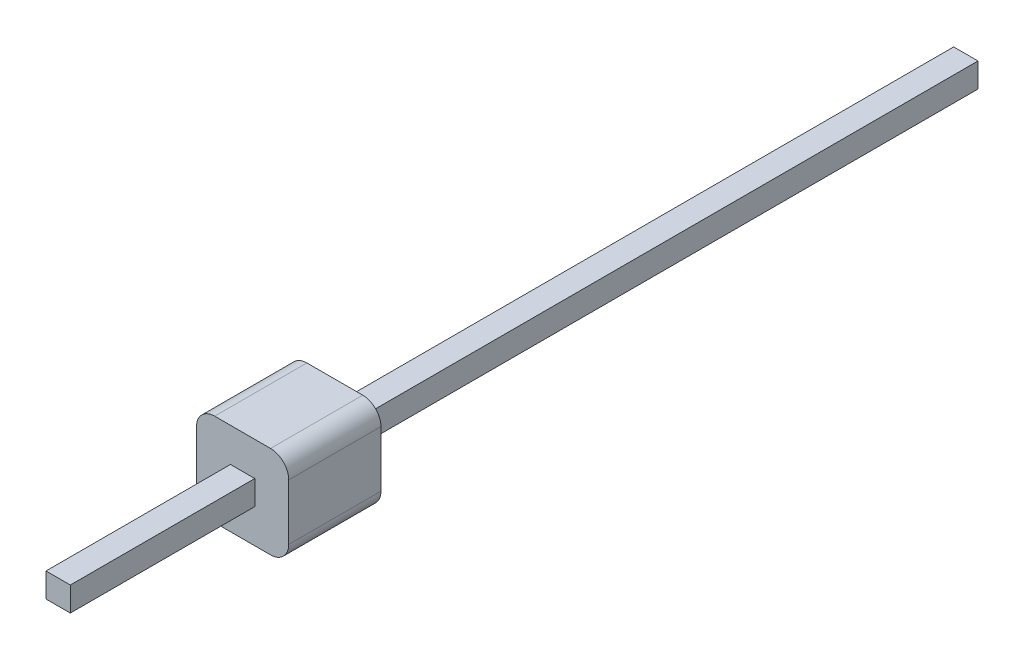
ISO-10303-21;
HEADER;
FILE_DESCRIPTION(('STEP AP214'),'2;1');
FILE_NAME('part.step','',(''),(''),'','','');
FILE_SCHEMA(('AUTOMOTIVE_DESIGN { 1 0 10303 214 1 1 1 1 }'));
ENDSEC;
DATA;
#1=APPLICATION_CONTEXT('core data for automotive mechanical design processes');
#2=APPLICATION_PROTOCOL_DEFINITION('international standard','automotive_design',2000,#1);
#3=PRODUCT_CONTEXT('',#1,'mechanical');
#4=PRODUCT('Part','Part','',(#3));
#5=PRODUCT_RELATED_PRODUCT_CATEGORY('part','',(#4));
#6=PRODUCT_DEFINITION_FORMATION('','',#4);
#7=PRODUCT_DEFINITION_CONTEXT('part definition',#1,'design');
#8=PRODUCT_DEFINITION('design','',#6,#7);
#9=PRODUCT_DEFINITION_SHAPE('','',#8);
#10=(LENGTH_UNIT() NAMED_UNIT(*) SI_UNIT(.MILLI.,.METRE.));
#11=(NAMED_UNIT(*) PLANE_ANGLE_UNIT() SI_UNIT($,.RADIAN.));
#12=(NAMED_UNIT(*) SI_UNIT($,.STERADIAN.) SOLID_ANGLE_UNIT());
#13=UNCERTAINTY_MEASURE_WITH_UNIT(LENGTH_MEASURE(1.E-05),#10,'distance_accuracy_value','');
#14=(GEOMETRIC_REPRESENTATION_CONTEXT(3) GLOBAL_UNCERTAINTY_ASSIGNED_CONTEXT((#13)) GLOBAL_UNIT_ASSIGNED_CONTEXT((#10,
#11,#12)) REPRESENTATION_CONTEXT('',''));
#15=CARTESIAN_POINT('',(0.,0.,0.));
#16=DIRECTION('',(0.,0.,1.));
#17=DIRECTION('',(1.,0.,0.));
#18=AXIS2_PLACEMENT_3D('',#15,#16,#17);
#19=CARTESIAN_POINT('',(-1.27,-0.0190907262086213,2.54));
#20=DIRECTION('',(0.,0.,1.));
#21=DIRECTION('',(1.,0.,0.));
#22=AXIS2_PLACEMENT_3D('',#19,#20,#21);
#23=PLANE('',#22);
#24=DIRECTION('',(1.,0.,0.));
#25=VECTOR('',#24,1.);
#26=CARTESIAN_POINT('',(-1.27,-2.55909072620862,2.54));
#27=LINE('',#26,#25);
#28=CARTESIAN_POINT('',(-0.769999999999999,-2.55909072620862,2.54));
#29=VERTEX_POINT('',#28);
#30=CARTESIAN_POINT('',(0.770000000000001,-2.55909072620862,2.54));
#31=VERTEX_POINT('',#30);
#32=EDGE_CURVE('E201',#29,#31,#27,.T.);
#33=ORIENTED_EDGE('',*,*,#32,.T.);
#34=CARTESIAN_POINT('',(0.770000000000001,-2.05909072620862,2.54));
#35=DIRECTION('',(0.,0.,1.));
#36=DIRECTION('',(1.,0.,0.));
#37=AXIS2_PLACEMENT_3D('',#34,#35,#36);
#38=CIRCLE('',#37,0.5);
#39=CARTESIAN_POINT('',(1.27,-2.05909072620862,2.54));
#40=VERTEX_POINT('',#39);
#41=EDGE_CURVE('E240',#31,#40,#38,.T.);
#42=ORIENTED_EDGE('',*,*,#41,.T.);
#43=DIRECTION('',(0.,1.,0.));
#44=VECTOR('',#43,1.);
#45=CARTESIAN_POINT('',(1.27,-0.019090726208621,2.54));
#46=LINE('',#45,#44);
#47=CARTESIAN_POINT('',(1.27,-0.519090726208621,2.54));
#48=VERTEX_POINT('',#47);
#49=EDGE_CURVE('E204',#40,#48,#46,.T.);
#50=ORIENTED_EDGE('',*,*,#49,.T.);
#51=CARTESIAN_POINT('',(0.770000000000001,-0.519090726208621,2.54));
#52=DIRECTION('',(0.,0.,1.));
#53=DIRECTION('',(1.,0.,0.));
#54=AXIS2_PLACEMENT_3D('',#51,#52,#53);
#55=CIRCLE('',#54,0.5);
#56=CARTESIAN_POINT('',(0.770000000000001,-0.019090726208621,2.54));
#57=VERTEX_POINT('',#56);
#58=EDGE_CURVE('E52',#48,#57,#55,.T.);
#59=ORIENTED_EDGE('',*,*,#58,.T.);
#60=DIRECTION('',(-1.,0.,0.));
#61=VECTOR('',#60,1.);
#62=CARTESIAN_POINT('',(-1.27,-0.0190907262086213,2.54));
#63=LINE('',#62,#61);
#64=CARTESIAN_POINT('',(-0.77,-0.0190907262086212,2.54));
#65=VERTEX_POINT('',#64);
#66=EDGE_CURVE('E206',#57,#65,#63,.T.);
#67=ORIENTED_EDGE('',*,*,#66,.T.);
#68=CARTESIAN_POINT('',(-0.769999999999999,-0.519090726208621,2.54));
#69=DIRECTION('',(0.,0.,1.));
#70=DIRECTION('',(1.,0.,0.));
#71=AXIS2_PLACEMENT_3D('',#68,#69,#70);
#72=CIRCLE('',#71,0.5);
#73=CARTESIAN_POINT('',(-1.27,-0.519090726208621,2.54));
#74=VERTEX_POINT('',#73);
#75=EDGE_CURVE('E236',#65,#74,#72,.T.);
#76=ORIENTED_EDGE('',*,*,#75,.T.);
#77=DIRECTION('',(0.,-1.,0.));
#78=VECTOR('',#77,1.);
#79=CARTESIAN_POINT('',(-1.27,-0.0190907262086213,2.54));
#80=LINE('',#79,#78);
#81=CARTESIAN_POINT('',(-1.27,-2.05909072620862,2.54));
#82=VERTEX_POINT('',#81);
#83=EDGE_CURVE('E198',#74,#82,#80,.T.);
#84=ORIENTED_EDGE('',*,*,#83,.T.);
#85=CARTESIAN_POINT('',(-0.769999999999999,-2.05909072620862,2.54));
#86=DIRECTION('',(0.,0.,1.));
#87=DIRECTION('',(1.,0.,0.));
#88=AXIS2_PLACEMENT_3D('',#85,#86,#87);
#89=CIRCLE('',#88,0.5);
#90=EDGE_CURVE('E238',#82,#29,#89,.T.);
#91=ORIENTED_EDGE('',*,*,#90,.T.);
#92=EDGE_LOOP('',(#33,#42,#50,#59,#67,#76,#84,#91));
#93=FACE_BOUND('',#92,.T.);
#94=DIRECTION('',(1.,0.,0.));
#95=VECTOR('',#94,1.);
#96=CARTESIAN_POINT('',(-1.27,-0.95409072620862,2.54));
#97=LINE('',#96,#95);
#98=CARTESIAN_POINT('',(-0.335,-0.954090726208621,2.54));
#99=VERTEX_POINT('',#98);
#100=CARTESIAN_POINT('',(0.335,-0.954090726208621,2.54));
#101=VERTEX_POINT('',#100);
#102=EDGE_CURVE('E170',#99,#101,#97,.T.);
#103=ORIENTED_EDGE('',*,*,#102,.T.);
#104=DIRECTION('',(0.,-1.,0.));
#105=VECTOR('',#104,1.);
#106=CARTESIAN_POINT('',(0.335000000000001,-0.0190907262086233,2.54));
#107=LINE('',#106,#105);
#108=CARTESIAN_POINT('',(0.334999999999999,-1.62409072620862,2.54));
#109=VERTEX_POINT('',#108);
#110=EDGE_CURVE('E184',#101,#109,#107,.T.);
#111=ORIENTED_EDGE('',*,*,#110,.T.);
#112=DIRECTION('',(-1.,0.,0.));
#113=VECTOR('',#112,1.);
#114=CARTESIAN_POINT('',(-1.27,-1.62409072620862,2.54));
#115=LINE('',#114,#113);
#116=CARTESIAN_POINT('',(-0.335,-1.62409072620862,2.54));
#117=VERTEX_POINT('',#116);
#118=EDGE_CURVE('E181',#109,#117,#115,.T.);
#119=ORIENTED_EDGE('',*,*,#118,.T.);
#120=DIRECTION('',(0.,1.,0.));
#121=VECTOR('',#120,1.);
#122=CARTESIAN_POINT('',(-0.335,-0.0190907262086213,2.54));
#123=LINE('',#122,#121);
#124=EDGE_CURVE('E174',#117,#99,#123,.T.);
#125=ORIENTED_EDGE('',*,*,#124,.T.);
#126=EDGE_LOOP('',(#103,#111,#119,#125));
#127=FACE_BOUND('',#126,.T.);
#128=ADVANCED_FACE('F32',(#93,#127),#23,.T.);
#129=CARTESIAN_POINT('',(-1.27,-0.0190907262086213,0.));
#130=DIRECTION('',(0.,0.,1.));
#131=DIRECTION('',(1.,0.,0.));
#132=AXIS2_PLACEMENT_3D('',#129,#130,#131);
#133=PLANE('',#132);
#134=DIRECTION('',(0.,1.,0.));
#135=VECTOR('',#134,1.);
#136=CARTESIAN_POINT('',(1.27,-0.019090726208621,0.));
#137=LINE('',#136,#135);
#138=CARTESIAN_POINT('',(1.27,-2.05909072620862,0.));
#139=VERTEX_POINT('',#138);
#140=CARTESIAN_POINT('',(1.27,-0.519090726208621,0.));
#141=VERTEX_POINT('',#140);
#142=EDGE_CURVE('E193',#139,#141,#137,.T.);
#143=ORIENTED_EDGE('',*,*,#142,.F.);
#144=CARTESIAN_POINT('',(0.770000000000001,-2.05909072620862,0.));
#145=DIRECTION('',(0.,0.,1.));
#146=DIRECTION('',(1.,0.,0.));
#147=AXIS2_PLACEMENT_3D('',#144,#145,#146);
#148=CIRCLE('',#147,0.5);
#149=CARTESIAN_POINT('',(0.770000000000001,-2.55909072620862,0.));
#150=VERTEX_POINT('',#149);
#151=EDGE_CURVE('E228',#139,#150,#148,.F.);
#152=ORIENTED_EDGE('',*,*,#151,.T.);
#153=DIRECTION('',(1.,0.,0.));
#154=VECTOR('',#153,1.);
#155=CARTESIAN_POINT('',(-1.27,-2.55909072620862,0.));
#156=LINE('',#155,#154);
#157=CARTESIAN_POINT('',(-0.769999999999999,-2.55909072620862,0.));
#158=VERTEX_POINT('',#157);
#159=EDGE_CURVE('E190',#158,#150,#156,.T.);
#160=ORIENTED_EDGE('',*,*,#159,.F.);
#161=CARTESIAN_POINT('',(-0.769999999999999,-2.05909072620862,0.));
#162=DIRECTION('',(0.,0.,1.));
#163=DIRECTION('',(1.,0.,0.));
#164=AXIS2_PLACEMENT_3D('',#161,#162,#163);
#165=CIRCLE('',#164,0.5);
#166=CARTESIAN_POINT('',(-1.27,-2.05909072620862,0.));
#167=VERTEX_POINT('',#166);
#168=EDGE_CURVE('E226',#158,#167,#165,.F.);
#169=ORIENTED_EDGE('',*,*,#168,.T.);
#170=DIRECTION('',(0.,-1.,0.));
#171=VECTOR('',#170,1.);
#172=CARTESIAN_POINT('',(-1.27,-0.0190907262086213,0.));
#173=LINE('',#172,#171);
#174=CARTESIAN_POINT('',(-1.27,-0.519090726208621,0.));
#175=VERTEX_POINT('',#174);
#176=EDGE_CURVE('E187',#175,#167,#173,.T.);
#177=ORIENTED_EDGE('',*,*,#176,.F.);
#178=CARTESIAN_POINT('',(-0.769999999999999,-0.519090726208621,0.));
#179=DIRECTION('',(0.,0.,1.));
#180=DIRECTION('',(1.,0.,0.));
#181=AXIS2_PLACEMENT_3D('',#178,#179,#180);
#182=CIRCLE('',#181,0.5);
#183=CARTESIAN_POINT('',(-0.77,-0.0190907262086212,0.));
#184=VERTEX_POINT('',#183);
#185=EDGE_CURVE('E224',#175,#184,#182,.F.);
#186=ORIENTED_EDGE('',*,*,#185,.T.);
#187=DIRECTION('',(-1.,0.,0.));
#188=VECTOR('',#187,1.);
#189=CARTESIAN_POINT('',(-1.27,-0.0190907262086213,0.));
#190=LINE('',#189,#188);
#191=CARTESIAN_POINT('',(0.770000000000001,-0.019090726208621,0.));
#192=VERTEX_POINT('',#191);
#193=EDGE_CURVE('E196',#192,#184,#190,.T.);
#194=ORIENTED_EDGE('',*,*,#193,.F.);
#195=CARTESIAN_POINT('',(0.770000000000001,-0.519090726208621,0.));
#196=DIRECTION('',(0.,0.,1.));
#197=DIRECTION('',(1.,0.,0.));
#198=AXIS2_PLACEMENT_3D('',#195,#196,#197);
#199=CIRCLE('',#198,0.5);
#200=EDGE_CURVE('E222',#192,#141,#199,.F.);
#201=ORIENTED_EDGE('',*,*,#200,.T.);
#202=EDGE_LOOP('',(#143,#152,#160,#169,#177,#186,#194,#201));
#203=FACE_BOUND('',#202,.T.);
#204=DIRECTION('',(0.,-1.,0.));
#205=VECTOR('',#204,1.);
#206=CARTESIAN_POINT('',(0.335000000000001,-0.0190907262086233,0.));
#207=LINE('',#206,#205);
#208=CARTESIAN_POINT('',(0.335,-0.954090726208621,0.));
#209=VERTEX_POINT('',#208);
#210=CARTESIAN_POINT('',(0.334999999999999,-1.62409072620862,0.));
#211=VERTEX_POINT('',#210);
#212=EDGE_CURVE('E169',#209,#211,#207,.T.);
#213=ORIENTED_EDGE('',*,*,#212,.F.);
#214=DIRECTION('',(1.,0.,0.));
#215=VECTOR('',#214,1.);
#216=CARTESIAN_POINT('',(-1.27,-0.95409072620862,0.));
#217=LINE('',#216,#215);
#218=CARTESIAN_POINT('',(-0.335,-0.95409072620862,0.));
#219=VERTEX_POINT('',#218);
#220=EDGE_CURVE('E208',#219,#209,#217,.T.);
#221=ORIENTED_EDGE('',*,*,#220,.F.);
#222=DIRECTION('',(0.,1.,0.));
#223=VECTOR('',#222,1.);
#224=CARTESIAN_POINT('',(-0.335,-0.0190907262086213,0.));
#225=LINE('',#224,#223);
#226=CARTESIAN_POINT('',(-0.335,-1.62409072620862,0.));
#227=VERTEX_POINT('',#226);
#228=EDGE_CURVE('E211',#227,#219,#225,.T.);
#229=ORIENTED_EDGE('',*,*,#228,.F.);
#230=DIRECTION('',(-1.,0.,0.));
#231=VECTOR('',#230,1.);
#232=CARTESIAN_POINT('',(-1.27,-1.62409072620862,0.));
#233=LINE('',#232,#231);
#234=EDGE_CURVE('E214',#211,#227,#233,.T.);
#235=ORIENTED_EDGE('',*,*,#234,.F.);
#236=EDGE_LOOP('',(#213,#221,#229,#235));
#237=FACE_BOUND('',#236,.T.);
#238=ADVANCED_FACE('F253',(#203,#237),#133,.F.);
#239=CARTESIAN_POINT('',(-1.27,-0.0190907262086213,2.54));
#240=DIRECTION('',(1.,0.,0.));
#241=DIRECTION('',(0.,0.,-1.));
#242=AXIS2_PLACEMENT_3D('',#239,#240,#241);
#243=PLANE('',#242);
#244=ORIENTED_EDGE('',*,*,#176,.T.);
#245=DIRECTION('',(0.,0.,-1.));
#246=VECTOR('',#245,1.);
#247=CARTESIAN_POINT('',(-1.27,-2.05909072620862,2.54));
#248=LINE('',#247,#246);
#249=EDGE_CURVE('E245',#167,#82,#248,.F.);
#250=ORIENTED_EDGE('',*,*,#249,.T.);
#251=ORIENTED_EDGE('',*,*,#83,.F.);
#252=DIRECTION('',(0.,0.,-1.));
#253=VECTOR('',#252,1.);
#254=CARTESIAN_POINT('',(-1.27,-0.519090726208621,2.54));
#255=LINE('',#254,#253);
#256=EDGE_CURVE('E242',#74,#175,#255,.T.);
#257=ORIENTED_EDGE('',*,*,#256,.T.);
#258=EDGE_LOOP('',(#244,#250,#251,#257));
#259=FACE_BOUND('',#258,.T.);
#260=ADVANCED_FACE('F262',(#259),#243,.F.);
#261=CARTESIAN_POINT('',(-1.27,-2.55909072620862,2.54));
#262=DIRECTION('',(0.,1.,0.));
#263=DIRECTION('',(-1.,0.,0.));
#264=AXIS2_PLACEMENT_3D('',#261,#262,#263);
#265=PLANE('',#264);
#266=ORIENTED_EDGE('',*,*,#159,.T.);
#267=DIRECTION('',(0.,0.,-1.));
#268=VECTOR('',#267,1.);
#269=CARTESIAN_POINT('',(0.770000000000001,-2.55909072620862,2.54));
#270=LINE('',#269,#268);
#271=EDGE_CURVE('E233',#150,#31,#270,.F.);
#272=ORIENTED_EDGE('',*,*,#271,.T.);
#273=ORIENTED_EDGE('',*,*,#32,.F.);
#274=DIRECTION('',(0.,0.,-1.));
#275=VECTOR('',#274,1.);
#276=CARTESIAN_POINT('',(-0.769999999999999,-2.55909072620862,2.54));
#277=LINE('',#276,#275);
#278=EDGE_CURVE('E230',#29,#158,#277,.T.);
#279=ORIENTED_EDGE('',*,*,#278,.T.);
#280=EDGE_LOOP('',(#266,#272,#273,#279));
#281=FACE_BOUND('',#280,.T.);
#282=ADVANCED_FACE('F272',(#281),#265,.F.);
#283=CARTESIAN_POINT('',(1.27,-0.019090726208621,2.54));
#284=DIRECTION('',(-1.,0.,0.));
#285=DIRECTION('',(0.,0.,1.));
#286=AXIS2_PLACEMENT_3D('',#283,#284,#285);
#287=PLANE('',#286);
#288=ORIENTED_EDGE('',*,*,#49,.F.);
#289=DIRECTION('',(0.,0.,-1.));
#290=VECTOR('',#289,1.);
#291=CARTESIAN_POINT('',(1.27,-2.05909072620862,2.54));
#292=LINE('',#291,#290);
#293=EDGE_CURVE('E219',#40,#139,#292,.T.);
#294=ORIENTED_EDGE('',*,*,#293,.T.);
#295=ORIENTED_EDGE('',*,*,#142,.T.);
#296=DIRECTION('',(0.,0.,-1.));
#297=VECTOR('',#296,1.);
#298=CARTESIAN_POINT('',(1.27,-0.519090726208621,2.54));
#299=LINE('',#298,#297);
#300=EDGE_CURVE('E217',#141,#48,#299,.F.);
#301=ORIENTED_EDGE('',*,*,#300,.T.);
#302=EDGE_LOOP('',(#288,#294,#295,#301));
#303=FACE_BOUND('',#302,.T.);
#304=ADVANCED_FACE('F280',(#303),#287,.F.);
#305=CARTESIAN_POINT('',(-1.27,-0.0190907262086213,2.54));
#306=DIRECTION('',(0.,-1.,0.));
#307=DIRECTION('',(1.,0.,0.));
#308=AXIS2_PLACEMENT_3D('',#305,#306,#307);
#309=PLANE('',#308);
#310=ORIENTED_EDGE('',*,*,#193,.T.);
#311=DIRECTION('',(0.,0.,-1.));
#312=VECTOR('',#311,1.);
#313=CARTESIAN_POINT('',(-0.77,-0.0190907262086212,2.54));
#314=LINE('',#313,#312);
#315=EDGE_CURVE('E11',#184,#65,#314,.F.);
#316=ORIENTED_EDGE('',*,*,#315,.T.);
#317=ORIENTED_EDGE('',*,*,#66,.F.);
#318=DIRECTION('',(0.,0.,-1.));
#319=VECTOR('',#318,1.);
#320=CARTESIAN_POINT('',(0.770000000000001,-0.019090726208621,2.54));
#321=LINE('',#320,#319);
#322=EDGE_CURVE('E40',#57,#192,#321,.T.);
#323=ORIENTED_EDGE('',*,*,#322,.T.);
#324=EDGE_LOOP('',(#310,#316,#317,#323));
#325=FACE_BOUND('',#324,.T.);
#326=ADVANCED_FACE('F249',(#325),#309,.F.);
#327=CARTESIAN_POINT('',(0.335,-0.954090726208619,-17.38));
#328=DIRECTION('',(0.,0.,-1.));
#329=DIRECTION('',(-1.,0.,0.));
#330=AXIS2_PLACEMENT_3D('',#327,#328,#329);
#331=PLANE('',#330);
#332=DIRECTION('',(0.,-1.,0.));
#333=VECTOR('',#332,1.);
#334=CARTESIAN_POINT('',(0.335,-0.954090726208619,-17.38));
#335=LINE('',#334,#333);
#336=CARTESIAN_POINT('',(0.335,-0.954090726208619,-17.38));
#337=VERTEX_POINT('',#336);
#338=CARTESIAN_POINT('',(0.334999999999999,-1.62409072620862,-17.38));
#339=VERTEX_POINT('',#338);
#340=EDGE_CURVE('E156',#337,#339,#335,.T.);
#341=ORIENTED_EDGE('',*,*,#340,.T.);
#342=DIRECTION('',(-1.,0.,0.));
#343=VECTOR('',#342,1.);
#344=CARTESIAN_POINT('',(0.334999999999999,-1.62409072620862,-17.38));
#345=LINE('',#344,#343);
#346=CARTESIAN_POINT('',(-0.335,-1.62409072620862,-17.38));
#347=VERTEX_POINT('',#346);
#348=EDGE_CURVE('E145',#339,#347,#345,.T.);
#349=ORIENTED_EDGE('',*,*,#348,.T.);
#350=DIRECTION('',(0.,1.,0.));
#351=VECTOR('',#350,1.);
#352=CARTESIAN_POINT('',(-0.335,-0.954090726208619,-17.38));
#353=LINE('',#352,#351);
#354=CARTESIAN_POINT('',(-0.335,-0.954090726208619,-17.38));
#355=VERTEX_POINT('',#354);
#356=EDGE_CURVE('E155',#347,#355,#353,.T.);
#357=ORIENTED_EDGE('',*,*,#356,.T.);
#358=DIRECTION('',(1.,0.,0.));
#359=VECTOR('',#358,1.);
#360=CARTESIAN_POINT('',(0.335,-0.954090726208619,-17.38));
#361=LINE('',#360,#359);
#362=EDGE_CURVE('E161',#355,#337,#361,.T.);
#363=ORIENTED_EDGE('',*,*,#362,.T.);
#364=EDGE_LOOP('',(#341,#349,#357,#363));
#365=FACE_BOUND('',#364,.T.);
#366=ADVANCED_FACE('F159',(#365),#331,.T.);
#367=CARTESIAN_POINT('',(0.335,-0.954090726208619,-17.38));
#368=DIRECTION('',(0.,-1.,0.));
#369=DIRECTION('',(1.,0.,0.));
#370=AXIS2_PLACEMENT_3D('',#367,#368,#369);
#371=PLANE('',#370);
#372=DIRECTION('',(0.,0.,1.));
#373=VECTOR('',#372,1.);
#374=CARTESIAN_POINT('',(-0.335,-0.954090726208619,-17.38));
#375=LINE('',#374,#373);
#376=EDGE_CURVE('E452',#355,#219,#375,.T.);
#377=ORIENTED_EDGE('',*,*,#376,.T.);
#378=ORIENTED_EDGE('',*,*,#220,.T.);
#379=DIRECTION('',(0.,0.,1.));
#380=VECTOR('',#379,1.);
#381=CARTESIAN_POINT('',(0.335,-0.954090726208619,-17.38));
#382=LINE('',#381,#380);
#383=EDGE_CURVE('E455',#337,#209,#382,.T.);
#384=ORIENTED_EDGE('',*,*,#383,.F.);
#385=ORIENTED_EDGE('',*,*,#362,.F.);
#386=EDGE_LOOP('',(#377,#378,#384,#385));
#387=FACE_BOUND('',#386,.T.);
#388=ADVANCED_FACE('F347',(#387),#371,.F.);
#389=CARTESIAN_POINT('',(-0.335,-0.954090726208619,-17.38));
#390=DIRECTION('',(1.,0.,0.));
#391=DIRECTION('',(0.,0.,-1.));
#392=AXIS2_PLACEMENT_3D('',#389,#390,#391);
#393=PLANE('',#392);
#394=DIRECTION('',(0.,0.,1.));
#395=VECTOR('',#394,1.);
#396=CARTESIAN_POINT('',(-0.335,-1.62409072620862,-17.38));
#397=LINE('',#396,#395);
#398=EDGE_CURVE('E152',#347,#227,#397,.T.);
#399=ORIENTED_EDGE('',*,*,#398,.T.);
#400=ORIENTED_EDGE('',*,*,#228,.T.);
#401=ORIENTED_EDGE('',*,*,#376,.F.);
#402=ORIENTED_EDGE('',*,*,#356,.F.);
#403=EDGE_LOOP('',(#399,#400,#401,#402));
#404=FACE_BOUND('',#403,.T.);
#405=ADVANCED_FACE('F357',(#404),#393,.F.);
#406=CARTESIAN_POINT('',(0.334999999999999,-1.62409072620862,-17.38));
#407=DIRECTION('',(0.,1.,0.));
#408=DIRECTION('',(0.,0.,1.));
#409=AXIS2_PLACEMENT_3D('',#406,#407,#408);
#410=PLANE('',#409);
#411=DIRECTION('',(0.,0.,1.));
#412=VECTOR('',#411,1.);
#413=CARTESIAN_POINT('',(0.334999999999999,-1.62409072620862,-17.38));
#414=LINE('',#413,#412);
#415=EDGE_CURVE('E150',#339,#211,#414,.T.);
#416=ORIENTED_EDGE('',*,*,#415,.T.);
#417=ORIENTED_EDGE('',*,*,#234,.T.);
#418=ORIENTED_EDGE('',*,*,#398,.F.);
#419=ORIENTED_EDGE('',*,*,#348,.F.);
#420=EDGE_LOOP('',(#416,#417,#418,#419));
#421=FACE_BOUND('',#420,.T.);
#422=ADVANCED_FACE('F147',(#421),#410,.F.);
#423=CARTESIAN_POINT('',(0.335,-0.954090726208619,-17.38));
#424=DIRECTION('',(-1.,0.,0.));
#425=DIRECTION('',(0.,-1.,0.));
#426=AXIS2_PLACEMENT_3D('',#423,#424,#425);
#427=PLANE('',#426);
#428=ORIENTED_EDGE('',*,*,#383,.T.);
#429=ORIENTED_EDGE('',*,*,#212,.T.);
#430=ORIENTED_EDGE('',*,*,#415,.F.);
#431=ORIENTED_EDGE('',*,*,#340,.F.);
#432=EDGE_LOOP('',(#428,#429,#430,#431));
#433=FACE_BOUND('',#432,.T.);
#434=ADVANCED_FACE('F168',(#433),#427,.F.);
#435=ORIENTED_EDGE('',*,*,#110,.F.);
#436=CARTESIAN_POINT('',(0.335,-0.954090726208622,7.62));
#437=VERTEX_POINT('',#436);
#438=EDGE_CURVE('E458',#101,#437,#382,.T.);
#439=ORIENTED_EDGE('',*,*,#438,.T.);
#440=DIRECTION('',(0.,-1.,0.));
#441=VECTOR('',#440,1.);
#442=CARTESIAN_POINT('',(0.335,-0.954090726208622,7.62));
#443=LINE('',#442,#441);
#444=CARTESIAN_POINT('',(0.334999999999999,-1.62409072620862,7.62));
#445=VERTEX_POINT('',#444);
#446=EDGE_CURVE('E467',#437,#445,#443,.T.);
#447=ORIENTED_EDGE('',*,*,#446,.T.);
#448=EDGE_CURVE('E171',#109,#445,#414,.T.);
#449=ORIENTED_EDGE('',*,*,#448,.F.);
#450=EDGE_LOOP('',(#435,#439,#447,#449));
#451=FACE_BOUND('',#450,.T.);
#452=ADVANCED_FACE('F364',(#451),#427,.F.);
#453=ORIENTED_EDGE('',*,*,#118,.F.);
#454=ORIENTED_EDGE('',*,*,#448,.T.);
#455=DIRECTION('',(-1.,0.,0.));
#456=VECTOR('',#455,1.);
#457=CARTESIAN_POINT('',(0.334999999999999,-1.62409072620862,7.62));
#458=LINE('',#457,#456);
#459=CARTESIAN_POINT('',(-0.335,-1.62409072620862,7.62));
#460=VERTEX_POINT('',#459);
#461=EDGE_CURVE('E464',#445,#460,#458,.T.);
#462=ORIENTED_EDGE('',*,*,#461,.T.);
#463=EDGE_CURVE('E453',#117,#460,#397,.T.);
#464=ORIENTED_EDGE('',*,*,#463,.F.);
#465=EDGE_LOOP('',(#453,#454,#462,#464));
#466=FACE_BOUND('',#465,.T.);
#467=ADVANCED_FACE('F354',(#466),#410,.F.);
#468=ORIENTED_EDGE('',*,*,#124,.F.);
#469=ORIENTED_EDGE('',*,*,#463,.T.);
#470=DIRECTION('',(0.,1.,0.));
#471=VECTOR('',#470,1.);
#472=CARTESIAN_POINT('',(-0.335,-0.954090726208621,7.62));
#473=LINE('',#472,#471);
#474=CARTESIAN_POINT('',(-0.335,-0.954090726208621,7.62));
#475=VERTEX_POINT('',#474);
#476=EDGE_CURVE('E461',#460,#475,#473,.T.);
#477=ORIENTED_EDGE('',*,*,#476,.T.);
#478=EDGE_CURVE('E454',#99,#475,#375,.T.);
#479=ORIENTED_EDGE('',*,*,#478,.F.);
#480=EDGE_LOOP('',(#468,#469,#477,#479));
#481=FACE_BOUND('',#480,.T.);
#482=ADVANCED_FACE('F344',(#481),#393,.F.);
#483=ORIENTED_EDGE('',*,*,#102,.F.);
#484=ORIENTED_EDGE('',*,*,#478,.T.);
#485=DIRECTION('',(1.,0.,0.));
#486=VECTOR('',#485,1.);
#487=CARTESIAN_POINT('',(0.335,-0.954090726208622,7.62));
#488=LINE('',#487,#486);
#489=EDGE_CURVE('E165',#475,#437,#488,.T.);
#490=ORIENTED_EDGE('',*,*,#489,.T.);
#491=ORIENTED_EDGE('',*,*,#438,.F.);
#492=EDGE_LOOP('',(#483,#484,#490,#491));
#493=FACE_BOUND('',#492,.T.);
#494=ADVANCED_FACE('F335',(#493),#371,.F.);
#495=CARTESIAN_POINT('',(0.335,-0.954090726208622,7.62));
#496=DIRECTION('',(0.,0.,-1.));
#497=DIRECTION('',(-1.,0.,0.));
#498=AXIS2_PLACEMENT_3D('',#495,#496,#497);
#499=PLANE('',#498);
#500=ORIENTED_EDGE('',*,*,#446,.F.);
#501=ORIENTED_EDGE('',*,*,#489,.F.);
#502=ORIENTED_EDGE('',*,*,#476,.F.);
#503=ORIENTED_EDGE('',*,*,#461,.F.);
#504=EDGE_LOOP('',(#500,#501,#502,#503));
#505=FACE_BOUND('',#504,.T.);
#506=ADVANCED_FACE('F304',(#505),#499,.F.);
#507=CARTESIAN_POINT('',(0.770000000000001,-2.05909072620862,2.54));
#508=DIRECTION('',(0.,0.,-1.));
#509=DIRECTION('',(-1.,0.,0.));
#510=AXIS2_PLACEMENT_3D('',#507,#508,#509);
#511=CYLINDRICAL_SURFACE('',#510,0.5);
#512=ORIENTED_EDGE('',*,*,#41,.F.);
#513=ORIENTED_EDGE('',*,*,#271,.F.);
#514=ORIENTED_EDGE('',*,*,#151,.F.);
#515=ORIENTED_EDGE('',*,*,#293,.F.);
#516=EDGE_LOOP('',(#512,#513,#514,#515));
#517=FACE_BOUND('',#516,.T.);
#518=ADVANCED_FACE('F277',(#517),#511,.T.);
#519=CARTESIAN_POINT('',(-0.769999999999999,-2.05909072620862,2.54));
#520=DIRECTION('',(0.,0.,-1.));
#521=DIRECTION('',(-1.,0.,0.));
#522=AXIS2_PLACEMENT_3D('',#519,#520,#521);
#523=CYLINDRICAL_SURFACE('',#522,0.5);
#524=ORIENTED_EDGE('',*,*,#90,.F.);
#525=ORIENTED_EDGE('',*,*,#249,.F.);
#526=ORIENTED_EDGE('',*,*,#168,.F.);
#527=ORIENTED_EDGE('',*,*,#278,.F.);
#528=EDGE_LOOP('',(#524,#525,#526,#527));
#529=FACE_BOUND('',#528,.T.);
#530=ADVANCED_FACE('F269',(#529),#523,.T.);
#531=CARTESIAN_POINT('',(-0.769999999999999,-0.519090726208621,2.54));
#532=DIRECTION('',(0.,0.,-1.));
#533=DIRECTION('',(-1.,0.,0.));
#534=AXIS2_PLACEMENT_3D('',#531,#532,#533);
#535=CYLINDRICAL_SURFACE('',#534,0.5);
#536=ORIENTED_EDGE('',*,*,#75,.F.);
#537=ORIENTED_EDGE('',*,*,#315,.F.);
#538=ORIENTED_EDGE('',*,*,#185,.F.);
#539=ORIENTED_EDGE('',*,*,#256,.F.);
#540=EDGE_LOOP('',(#536,#537,#538,#539));
#541=FACE_BOUND('',#540,.T.);
#542=ADVANCED_FACE('F259',(#541),#535,.T.);
#543=CARTESIAN_POINT('',(0.770000000000001,-0.519090726208621,2.54));
#544=DIRECTION('',(0.,0.,-1.));
#545=DIRECTION('',(-1.,0.,0.));
#546=AXIS2_PLACEMENT_3D('',#543,#544,#545);
#547=CYLINDRICAL_SURFACE('',#546,0.5);
#548=ORIENTED_EDGE('',*,*,#58,.F.);
#549=ORIENTED_EDGE('',*,*,#300,.F.);
#550=ORIENTED_EDGE('',*,*,#200,.F.);
#551=ORIENTED_EDGE('',*,*,#322,.F.);
#552=EDGE_LOOP('',(#548,#549,#550,#551));
#553=FACE_BOUND('',#552,.T.);
#554=ADVANCED_FACE('F34',(#553),#547,.T.);
#555=CLOSED_SHELL('',(#128,#238,#260,#282,#304,#326,#366,#388,#405,#422,#434,#452,#467,#482,
#494,#506,#518,#530,#542,#554));
#556=MANIFOLD_SOLID_BREP('B2',#555);
#557=ADVANCED_BREP_SHAPE_REPRESENTATION('',(#18,#556),#14);
#558=SHAPE_DEFINITION_REPRESENTATION(#9,#557);
ENDSEC;
END-ISO-10303-21;
